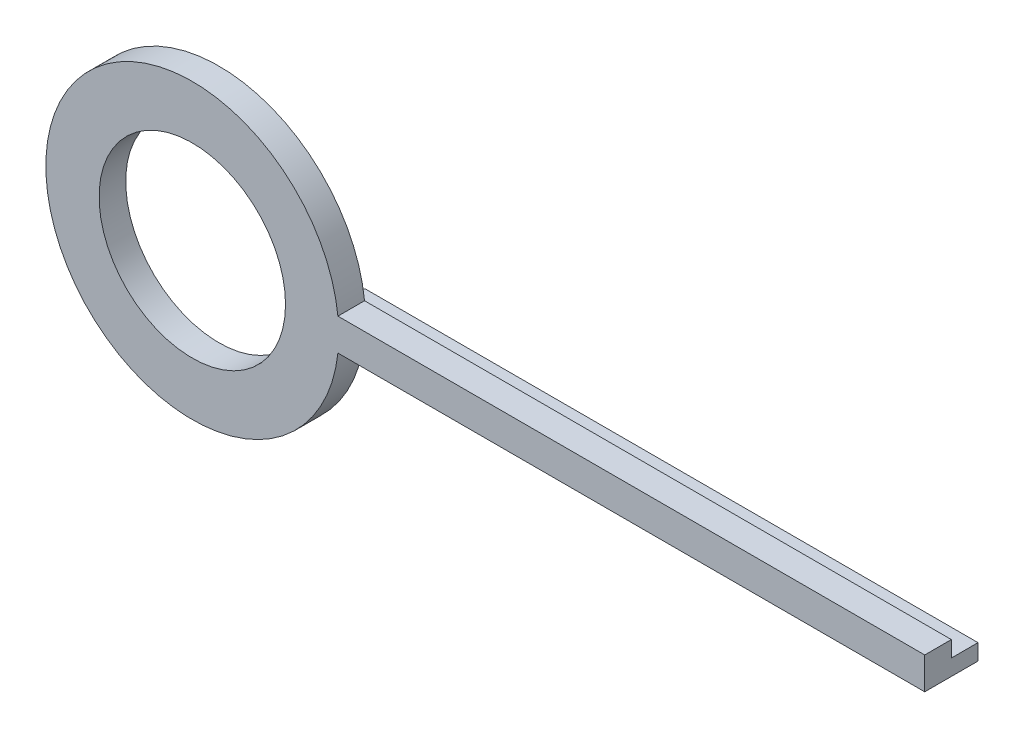
ISO-10303-21;
HEADER;
FILE_DESCRIPTION(('STEP AP214'),'2;1');
FILE_NAME('part.step','',(''),(''),'','','');
FILE_SCHEMA(('AUTOMOTIVE_DESIGN { 1 0 10303 214 1 1 1 1 }'));
ENDSEC;
DATA;
#1=APPLICATION_CONTEXT('core data for automotive mechanical design processes');
#2=APPLICATION_PROTOCOL_DEFINITION('international standard','automotive_design',2000,#1);
#3=PRODUCT_CONTEXT('',#1,'mechanical');
#4=PRODUCT('Part','Part','',(#3));
#5=PRODUCT_RELATED_PRODUCT_CATEGORY('part','',(#4));
#6=PRODUCT_DEFINITION_FORMATION('','',#4);
#7=PRODUCT_DEFINITION_CONTEXT('part definition',#1,'design');
#8=PRODUCT_DEFINITION('design','',#6,#7);
#9=PRODUCT_DEFINITION_SHAPE('','',#8);
#10=(LENGTH_UNIT() NAMED_UNIT(*) SI_UNIT(.MILLI.,.METRE.));
#11=(NAMED_UNIT(*) PLANE_ANGLE_UNIT() SI_UNIT($,.RADIAN.));
#12=(NAMED_UNIT(*) SI_UNIT($,.STERADIAN.) SOLID_ANGLE_UNIT());
#13=UNCERTAINTY_MEASURE_WITH_UNIT(LENGTH_MEASURE(1.E-05),#10,'distance_accuracy_value','');
#14=(GEOMETRIC_REPRESENTATION_CONTEXT(3) GLOBAL_UNCERTAINTY_ASSIGNED_CONTEXT((#13)) GLOBAL_UNIT_ASSIGNED_CONTEXT((#10,
#11,#12)) REPRESENTATION_CONTEXT('',''));
#15=CARTESIAN_POINT('',(0.,0.,0.));
#16=DIRECTION('',(0.,0.,1.));
#17=DIRECTION('',(1.,0.,0.));
#18=AXIS2_PLACEMENT_3D('',#15,#16,#17);
#19=CARTESIAN_POINT('',(0.,0.,5.));
#20=DIRECTION('',(0.,0.,1.));
#21=DIRECTION('',(1.,0.,0.));
#22=AXIS2_PLACEMENT_3D('',#19,#20,#21);
#23=PLANE('',#22);
#24=CARTESIAN_POINT('',(0.,0.,5.));
#25=DIRECTION('',(0.,0.,1.));
#26=DIRECTION('',(1.,0.,0.));
#27=AXIS2_PLACEMENT_3D('',#24,#25,#26);
#28=CIRCLE('',#27,17.5);
#29=CARTESIAN_POINT('',(17.5,0.,5.));
#30=VERTEX_POINT('',#29);
#31=EDGE_CURVE('E135',#30,#30,#28,.T.);
#32=ORIENTED_EDGE('',*,*,#31,.F.);
#33=EDGE_LOOP('',(#32));
#34=FACE_BOUND('',#33,.T.);
#35=DIRECTION('',(-1.,0.,0.));
#36=VECTOR('',#35,1.);
#37=CARTESIAN_POINT('',(17.5,3.,5.));
#38=LINE('',#37,#36);
#39=CARTESIAN_POINT('',(137.5,3.,5.));
#40=VERTEX_POINT('',#39);
#41=CARTESIAN_POINT('',(27.3358738656733,3.,5.));
#42=VERTEX_POINT('',#41);
#43=EDGE_CURVE('E117',#40,#42,#38,.T.);
#44=ORIENTED_EDGE('',*,*,#43,.T.);
#45=CARTESIAN_POINT('',(0.,0.,5.));
#46=DIRECTION('',(0.,0.,1.));
#47=DIRECTION('',(1.,0.,0.));
#48=AXIS2_PLACEMENT_3D('',#45,#46,#47);
#49=CIRCLE('',#48,27.5);
#50=CARTESIAN_POINT('',(27.3358738656733,-3.,5.));
#51=VERTEX_POINT('',#50);
#52=EDGE_CURVE('E140',#42,#51,#49,.T.);
#53=ORIENTED_EDGE('',*,*,#52,.T.);
#54=DIRECTION('',(1.,0.,0.));
#55=VECTOR('',#54,1.);
#56=CARTESIAN_POINT('',(17.5,-3.,5.));
#57=LINE('',#56,#55);
#58=CARTESIAN_POINT('',(137.5,-3.,5.));
#59=VERTEX_POINT('',#58);
#60=EDGE_CURVE('E113',#51,#59,#57,.T.);
#61=ORIENTED_EDGE('',*,*,#60,.T.);
#62=DIRECTION('',(0.,1.,0.));
#63=VECTOR('',#62,1.);
#64=CARTESIAN_POINT('',(137.5,3.,5.));
#65=LINE('',#64,#63);
#66=EDGE_CURVE('E122',#59,#40,#65,.T.);
#67=ORIENTED_EDGE('',*,*,#66,.T.);
#68=EDGE_LOOP('',(#44,#53,#61,#67));
#69=FACE_BOUND('',#68,.T.);
#70=ADVANCED_FACE('F33',(#34,#69),#23,.T.);
#71=CARTESIAN_POINT('',(0.,0.,0.));
#72=DIRECTION('',(0.,0.,1.));
#73=DIRECTION('',(1.,0.,0.));
#74=AXIS2_PLACEMENT_3D('',#71,#72,#73);
#75=PLANE('',#74);
#76=CARTESIAN_POINT('',(0.,0.,0.));
#77=DIRECTION('',(0.,0.,1.));
#78=DIRECTION('',(1.,0.,0.));
#79=AXIS2_PLACEMENT_3D('',#76,#77,#78);
#80=CIRCLE('',#79,27.5);
#81=CARTESIAN_POINT('',(27.3358738656733,3.,0.));
#82=VERTEX_POINT('',#81);
#83=CARTESIAN_POINT('',(27.3358738656733,-3.,0.));
#84=VERTEX_POINT('',#83);
#85=EDGE_CURVE('E138',#82,#84,#80,.T.);
#86=ORIENTED_EDGE('',*,*,#85,.F.);
#87=DIRECTION('',(-1.,0.,0.));
#88=VECTOR('',#87,1.);
#89=CARTESIAN_POINT('',(157.5,3.,0.));
#90=LINE('',#89,#88);
#91=CARTESIAN_POINT('',(137.5,3.,0.));
#92=VERTEX_POINT('',#91);
#93=EDGE_CURVE('E107',#92,#82,#90,.T.);
#94=ORIENTED_EDGE('',*,*,#93,.F.);
#95=DIRECTION('',(0.,-1.,0.));
#96=VECTOR('',#95,1.);
#97=CARTESIAN_POINT('',(137.5,3.,0.));
#98=LINE('',#97,#96);
#99=CARTESIAN_POINT('',(137.5,0.,0.));
#100=VERTEX_POINT('',#99);
#101=EDGE_CURVE('E106',#92,#100,#98,.T.);
#102=ORIENTED_EDGE('',*,*,#101,.T.);
#103=DIRECTION('',(-1.,0.,0.));
#104=VECTOR('',#103,1.);
#105=CARTESIAN_POINT('',(157.5,0.,0.));
#106=LINE('',#105,#104);
#107=CARTESIAN_POINT('',(17.5,0.,0.));
#108=VERTEX_POINT('',#107);
#109=EDGE_CURVE('E93',#100,#108,#106,.T.);
#110=ORIENTED_EDGE('',*,*,#109,.T.);
#111=CARTESIAN_POINT('',(0.,0.,0.));
#112=DIRECTION('',(0.,0.,1.));
#113=DIRECTION('',(1.,0.,0.));
#114=AXIS2_PLACEMENT_3D('',#111,#112,#113);
#115=CIRCLE('',#114,17.5);
#116=EDGE_CURVE('E104',#108,#108,#115,.T.);
#117=ORIENTED_EDGE('',*,*,#116,.T.);
#118=DIRECTION('',(0.,-1.,0.));
#119=VECTOR('',#118,1.);
#120=CARTESIAN_POINT('',(17.5,0.,0.));
#121=LINE('',#120,#119);
#122=CARTESIAN_POINT('',(17.5,-3.,0.));
#123=VERTEX_POINT('',#122);
#124=EDGE_CURVE('E128',#108,#123,#121,.T.);
#125=ORIENTED_EDGE('',*,*,#124,.T.);
#126=DIRECTION('',(1.,0.,0.));
#127=VECTOR('',#126,1.);
#128=CARTESIAN_POINT('',(0.,-3.,0.));
#129=LINE('',#128,#127);
#130=EDGE_CURVE('E132',#123,#84,#129,.T.);
#131=ORIENTED_EDGE('',*,*,#130,.T.);
#132=EDGE_LOOP('',(#86,#94,#102,#110,#117,#125,#131));
#133=FACE_BOUND('',#132,.T.);
#134=ADVANCED_FACE('F101',(#133),#75,.F.);
#135=CARTESIAN_POINT('',(0.,0.,5.));
#136=DIRECTION('',(0.,0.,-1.));
#137=DIRECTION('',(-1.,0.,0.));
#138=AXIS2_PLACEMENT_3D('',#135,#136,#137);
#139=CYLINDRICAL_SURFACE('',#138,27.5);
#140=ORIENTED_EDGE('',*,*,#52,.F.);
#141=DIRECTION('',(0.,0.,-1.));
#142=VECTOR('',#141,1.);
#143=CARTESIAN_POINT('',(27.3358738656733,3.,5.));
#144=LINE('',#143,#142);
#145=EDGE_CURVE('E148',#42,#82,#144,.T.);
#146=ORIENTED_EDGE('',*,*,#145,.T.);
#147=ORIENTED_EDGE('',*,*,#85,.T.);
#148=DIRECTION('',(0.,0.,-1.));
#149=VECTOR('',#148,1.);
#150=CARTESIAN_POINT('',(27.3358738656733,-3.,5.));
#151=LINE('',#150,#149);
#152=EDGE_CURVE('E143',#84,#51,#151,.F.);
#153=ORIENTED_EDGE('',*,*,#152,.T.);
#154=EDGE_LOOP('',(#140,#146,#147,#153));
#155=FACE_BOUND('',#154,.T.);
#156=ADVANCED_FACE('F162',(#155),#139,.T.);
#157=CARTESIAN_POINT('',(0.,0.,5.));
#158=DIRECTION('',(0.,0.,-1.));
#159=DIRECTION('',(-1.,0.,0.));
#160=AXIS2_PLACEMENT_3D('',#157,#158,#159);
#161=CYLINDRICAL_SURFACE('',#160,17.5);
#162=ORIENTED_EDGE('',*,*,#116,.F.);
#163=EDGE_LOOP('',(#162));
#164=FACE_BOUND('',#163,.T.);
#165=ORIENTED_EDGE('',*,*,#31,.T.);
#166=EDGE_LOOP('',(#165));
#167=FACE_BOUND('',#166,.T.);
#168=ADVANCED_FACE('F178',(#164,#167),#161,.F.);
#169=CARTESIAN_POINT('',(17.5,3.,-5.));
#170=DIRECTION('',(0.,1.,0.));
#171=DIRECTION('',(0.,0.,1.));
#172=AXIS2_PLACEMENT_3D('',#169,#170,#171);
#173=PLANE('',#172);
#174=ORIENTED_EDGE('',*,*,#93,.T.);
#175=ORIENTED_EDGE('',*,*,#145,.F.);
#176=ORIENTED_EDGE('',*,*,#43,.F.);
#177=DIRECTION('',(0.,0.,1.));
#178=VECTOR('',#177,1.);
#179=CARTESIAN_POINT('',(137.5,3.,-5.));
#180=LINE('',#179,#178);
#181=EDGE_CURVE('E126',#92,#40,#180,.T.);
#182=ORIENTED_EDGE('',*,*,#181,.F.);
#183=EDGE_LOOP('',(#174,#175,#176,#182));
#184=FACE_BOUND('',#183,.T.);
#185=ADVANCED_FACE('F166',(#184),#173,.T.);
#186=CARTESIAN_POINT('',(17.5,-3.,-5.));
#187=DIRECTION('',(0.,-1.,0.));
#188=DIRECTION('',(0.,0.,-1.));
#189=AXIS2_PLACEMENT_3D('',#186,#187,#188);
#190=PLANE('',#189);
#191=ORIENTED_EDGE('',*,*,#130,.F.);
#192=DIRECTION('',(0.70710678118655,0.,-0.707106781186546));
#193=VECTOR('',#192,1.);
#194=CARTESIAN_POINT('',(20.,-3.,-2.49999999999999));
#195=LINE('',#194,#193);
#196=CARTESIAN_POINT('',(22.5,-3.,-5.));
#197=VERTEX_POINT('',#196);
#198=EDGE_CURVE('E55',#123,#197,#195,.T.);
#199=ORIENTED_EDGE('',*,*,#198,.T.);
#200=DIRECTION('',(1.,0.,0.));
#201=VECTOR('',#200,1.);
#202=CARTESIAN_POINT('',(17.5,-3.,-5.));
#203=LINE('',#202,#201);
#204=CARTESIAN_POINT('',(137.5,-3.,-5.));
#205=VERTEX_POINT('',#204);
#206=EDGE_CURVE('E114',#197,#205,#203,.T.);
#207=ORIENTED_EDGE('',*,*,#206,.T.);
#208=DIRECTION('',(0.,0.,1.));
#209=VECTOR('',#208,1.);
#210=CARTESIAN_POINT('',(137.5,-3.,-5.));
#211=LINE('',#210,#209);
#212=EDGE_CURVE('E120',#205,#59,#211,.T.);
#213=ORIENTED_EDGE('',*,*,#212,.T.);
#214=ORIENTED_EDGE('',*,*,#60,.F.);
#215=ORIENTED_EDGE('',*,*,#152,.F.);
#216=EDGE_LOOP('',(#191,#199,#207,#213,#214,#215));
#217=FACE_BOUND('',#216,.T.);
#218=ADVANCED_FACE('F159',(#217),#190,.T.);
#219=CARTESIAN_POINT('',(137.5,3.,-5.));
#220=DIRECTION('',(1.,0.,0.));
#221=DIRECTION('',(0.,0.,-1.));
#222=AXIS2_PLACEMENT_3D('',#219,#220,#221);
#223=PLANE('',#222);
#224=ORIENTED_EDGE('',*,*,#101,.F.);
#225=ORIENTED_EDGE('',*,*,#181,.T.);
#226=ORIENTED_EDGE('',*,*,#66,.F.);
#227=ORIENTED_EDGE('',*,*,#212,.F.);
#228=DIRECTION('',(0.,1.,0.));
#229=VECTOR('',#228,1.);
#230=CARTESIAN_POINT('',(137.5,3.,-5.));
#231=LINE('',#230,#229);
#232=CARTESIAN_POINT('',(137.5,0.,-5.));
#233=VERTEX_POINT('',#232);
#234=EDGE_CURVE('E116',#205,#233,#231,.T.);
#235=ORIENTED_EDGE('',*,*,#234,.T.);
#236=DIRECTION('',(0.,0.,-1.));
#237=VECTOR('',#236,1.);
#238=CARTESIAN_POINT('',(137.5,0.,-5.));
#239=LINE('',#238,#237);
#240=EDGE_CURVE('E109',#100,#233,#239,.T.);
#241=ORIENTED_EDGE('',*,*,#240,.F.);
#242=EDGE_LOOP('',(#224,#225,#226,#227,#235,#241));
#243=FACE_BOUND('',#242,.T.);
#244=ADVANCED_FACE('F157',(#243),#223,.T.);
#245=CARTESIAN_POINT('',(0.,0.,-5.));
#246=DIRECTION('',(0.,0.,1.));
#247=DIRECTION('',(1.,0.,0.));
#248=AXIS2_PLACEMENT_3D('',#245,#246,#247);
#249=PLANE('',#248);
#250=ORIENTED_EDGE('',*,*,#206,.F.);
#251=DIRECTION('',(0.,1.,0.));
#252=VECTOR('',#251,1.);
#253=CARTESIAN_POINT('',(22.5,0.,-5.));
#254=LINE('',#253,#252);
#255=CARTESIAN_POINT('',(22.5,0.,-5.));
#256=VERTEX_POINT('',#255);
#257=EDGE_CURVE('E41',#197,#256,#254,.T.);
#258=ORIENTED_EDGE('',*,*,#257,.T.);
#259=DIRECTION('',(1.,0.,0.));
#260=VECTOR('',#259,1.);
#261=CARTESIAN_POINT('',(0.,0.,-5.));
#262=LINE('',#261,#260);
#263=EDGE_CURVE('E95',#256,#233,#262,.T.);
#264=ORIENTED_EDGE('',*,*,#263,.T.);
#265=ORIENTED_EDGE('',*,*,#234,.F.);
#266=EDGE_LOOP('',(#250,#258,#264,#265));
#267=FACE_BOUND('',#266,.T.);
#268=ADVANCED_FACE('F154',(#267),#249,.F.);
#269=CARTESIAN_POINT('',(157.5,0.,-5.));
#270=DIRECTION('',(0.,-1.,0.));
#271=DIRECTION('',(0.,0.,-1.));
#272=AXIS2_PLACEMENT_3D('',#269,#270,#271);
#273=PLANE('',#272);
#274=ORIENTED_EDGE('',*,*,#263,.F.);
#275=DIRECTION('',(-0.70710678118655,0.,0.707106781186546));
#276=VECTOR('',#275,1.);
#277=CARTESIAN_POINT('',(17.5,0.,0.));
#278=LINE('',#277,#276);
#279=EDGE_CURVE('E11',#256,#108,#278,.T.);
#280=ORIENTED_EDGE('',*,*,#279,.T.);
#281=ORIENTED_EDGE('',*,*,#109,.F.);
#282=ORIENTED_EDGE('',*,*,#240,.T.);
#283=EDGE_LOOP('',(#274,#280,#281,#282));
#284=FACE_BOUND('',#283,.T.);
#285=ADVANCED_FACE('F91',(#284),#273,.F.);
#286=CARTESIAN_POINT('',(17.5,3.,0.));
#287=DIRECTION('',(-0.707106781186545,0.,-0.707106781186549));
#288=DIRECTION('',(0.,1.,0.));
#289=AXIS2_PLACEMENT_3D('',#286,#287,#288);
#290=PLANE('',#289);
#291=ORIENTED_EDGE('',*,*,#279,.F.);
#292=ORIENTED_EDGE('',*,*,#257,.F.);
#293=ORIENTED_EDGE('',*,*,#198,.F.);
#294=ORIENTED_EDGE('',*,*,#124,.F.);
#295=EDGE_LOOP('',(#291,#292,#293,#294));
#296=FACE_BOUND('',#295,.T.);
#297=ADVANCED_FACE('F35',(#296),#290,.T.);
#298=CLOSED_SHELL('',(#70,#134,#156,#168,#185,#218,#244,#268,#285,#297));
#299=MANIFOLD_SOLID_BREP('B2',#298);
#300=ADVANCED_BREP_SHAPE_REPRESENTATION('',(#18,#299),#14);
#301=SHAPE_DEFINITION_REPRESENTATION(#9,#300);
ENDSEC;
END-ISO-10303-21;
